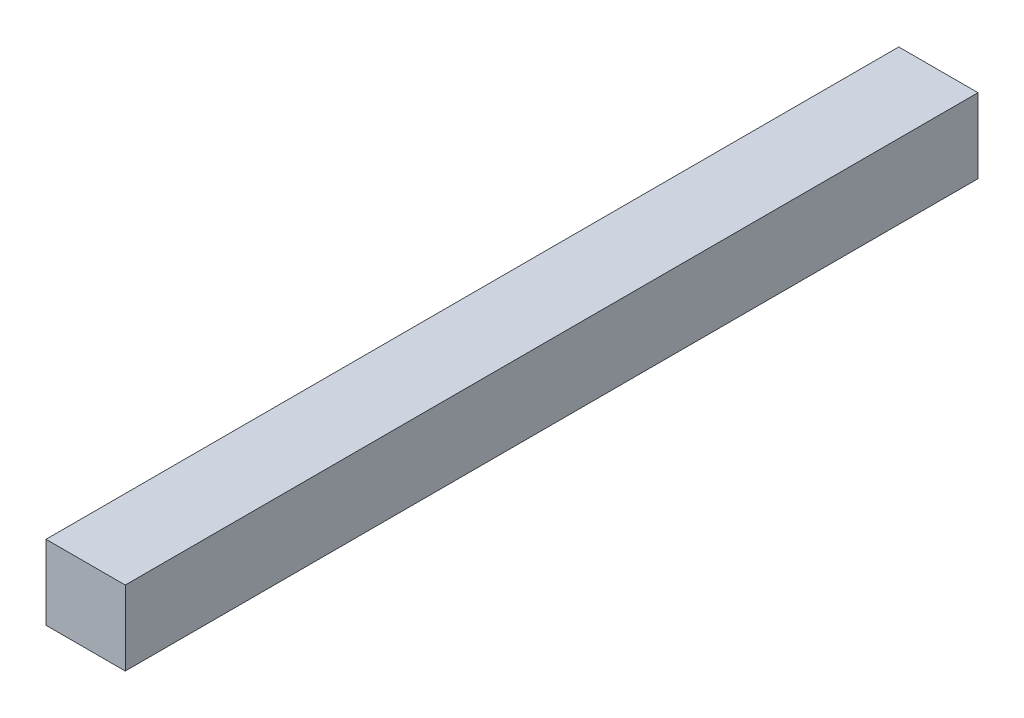
ISO-10303-21;
HEADER;
FILE_DESCRIPTION(('STEP AP214'),'2;1');
FILE_NAME('part.step','',(''),(''),'','','');
FILE_SCHEMA(('AUTOMOTIVE_DESIGN { 1 0 10303 214 1 1 1 1 }'));
ENDSEC;
DATA;
#1=APPLICATION_CONTEXT('core data for automotive mechanical design processes');
#2=APPLICATION_PROTOCOL_DEFINITION('international standard','automotive_design',2000,#1);
#3=PRODUCT_CONTEXT('',#1,'mechanical');
#4=PRODUCT('Part','Part','',(#3));
#5=PRODUCT_RELATED_PRODUCT_CATEGORY('part','',(#4));
#6=PRODUCT_DEFINITION_FORMATION('','',#4);
#7=PRODUCT_DEFINITION_CONTEXT('part definition',#1,'design');
#8=PRODUCT_DEFINITION('design','',#6,#7);
#9=PRODUCT_DEFINITION_SHAPE('','',#8);
#10=(LENGTH_UNIT() NAMED_UNIT(*) SI_UNIT(.MILLI.,.METRE.));
#11=(NAMED_UNIT(*) PLANE_ANGLE_UNIT() SI_UNIT($,.RADIAN.));
#12=(NAMED_UNIT(*) SI_UNIT($,.STERADIAN.) SOLID_ANGLE_UNIT());
#13=UNCERTAINTY_MEASURE_WITH_UNIT(LENGTH_MEASURE(1.E-05),#10,'distance_accuracy_value','');
#14=(GEOMETRIC_REPRESENTATION_CONTEXT(3) GLOBAL_UNCERTAINTY_ASSIGNED_CONTEXT((#13)) GLOBAL_UNIT_ASSIGNED_CONTEXT((#10,
#11,#12)) REPRESENTATION_CONTEXT('',''));
#15=CARTESIAN_POINT('',(0.,0.,0.));
#16=DIRECTION('',(0.,0.,1.));
#17=DIRECTION('',(1.,0.,0.));
#18=AXIS2_PLACEMENT_3D('',#15,#16,#17);
#19=CARTESIAN_POINT('',(-26.6666666666666,25.1515151515151,538.));
#20=DIRECTION('',(1.,0.,0.));
#21=DIRECTION('',(0.,1.,0.));
#22=AXIS2_PLACEMENT_3D('',#19,#20,#21);
#23=PLANE('',#22);
#24=DIRECTION('',(0.,-1.,0.));
#25=VECTOR('',#24,1.);
#26=CARTESIAN_POINT('',(-26.6666666666666,25.1515151515151,0.));
#27=LINE('',#26,#25);
#28=CARTESIAN_POINT('',(-26.6666666666666,25.1515151515151,0.));
#29=VERTEX_POINT('',#28);
#30=CARTESIAN_POINT('',(-26.6666666666666,-21.8484848484849,0.));
#31=VERTEX_POINT('',#30);
#32=EDGE_CURVE('E96',#29,#31,#27,.T.);
#33=ORIENTED_EDGE('',*,*,#32,.T.);
#34=DIRECTION('',(0.,0.,-1.));
#35=VECTOR('',#34,1.);
#36=CARTESIAN_POINT('',(-26.6666666666666,-21.8484848484849,538.));
#37=LINE('',#36,#35);
#38=CARTESIAN_POINT('',(-26.6666666666666,-21.8484848484849,538.));
#39=VERTEX_POINT('',#38);
#40=EDGE_CURVE('E11',#39,#31,#37,.T.);
#41=ORIENTED_EDGE('',*,*,#40,.F.);
#42=DIRECTION('',(0.,-1.,0.));
#43=VECTOR('',#42,1.);
#44=CARTESIAN_POINT('',(-26.6666666666666,25.1515151515151,538.));
#45=LINE('',#44,#43);
#46=CARTESIAN_POINT('',(-26.6666666666666,25.1515151515151,538.));
#47=VERTEX_POINT('',#46);
#48=EDGE_CURVE('E84',#47,#39,#45,.T.);
#49=ORIENTED_EDGE('',*,*,#48,.F.);
#50=DIRECTION('',(0.,0.,-1.));
#51=VECTOR('',#50,1.);
#52=CARTESIAN_POINT('',(-26.6666666666666,25.1515151515151,538.));
#53=LINE('',#52,#51);
#54=EDGE_CURVE('E92',#47,#29,#53,.T.);
#55=ORIENTED_EDGE('',*,*,#54,.T.);
#56=EDGE_LOOP('',(#33,#41,#49,#55));
#57=FACE_BOUND('',#56,.T.);
#58=ADVANCED_FACE('F33',(#57),#23,.F.);
#59=CARTESIAN_POINT('',(-26.6666666666666,-21.8484848484849,538.));
#60=DIRECTION('',(0.,1.,0.));
#61=DIRECTION('',(0.,0.,1.));
#62=AXIS2_PLACEMENT_3D('',#59,#60,#61);
#63=PLANE('',#62);
#64=DIRECTION('',(1.,0.,0.));
#65=VECTOR('',#64,1.);
#66=CARTESIAN_POINT('',(-26.6666666666666,-21.8484848484849,0.));
#67=LINE('',#66,#65);
#68=CARTESIAN_POINT('',(23.3333333333334,-21.8484848484849,0.));
#69=VERTEX_POINT('',#68);
#70=EDGE_CURVE('E88',#31,#69,#67,.T.);
#71=ORIENTED_EDGE('',*,*,#70,.T.);
#72=DIRECTION('',(0.,0.,-1.));
#73=VECTOR('',#72,1.);
#74=CARTESIAN_POINT('',(23.3333333333334,-21.8484848484849,538.));
#75=LINE('',#74,#73);
#76=CARTESIAN_POINT('',(23.3333333333334,-21.8484848484849,538.));
#77=VERTEX_POINT('',#76);
#78=EDGE_CURVE('E41',#77,#69,#75,.T.);
#79=ORIENTED_EDGE('',*,*,#78,.F.);
#80=DIRECTION('',(1.,0.,0.));
#81=VECTOR('',#80,1.);
#82=CARTESIAN_POINT('',(-26.6666666666666,-21.8484848484849,538.));
#83=LINE('',#82,#81);
#84=EDGE_CURVE('E79',#39,#77,#83,.T.);
#85=ORIENTED_EDGE('',*,*,#84,.F.);
#86=ORIENTED_EDGE('',*,*,#40,.T.);
#87=EDGE_LOOP('',(#71,#79,#85,#86));
#88=FACE_BOUND('',#87,.T.);
#89=ADVANCED_FACE('F87',(#88),#63,.F.);
#90=CARTESIAN_POINT('',(23.3333333333334,25.1515151515151,538.));
#91=DIRECTION('',(-1.,0.,0.));
#92=DIRECTION('',(0.,-1.,0.));
#93=AXIS2_PLACEMENT_3D('',#90,#91,#92);
#94=PLANE('',#93);
#95=DIRECTION('',(0.,1.,0.));
#96=VECTOR('',#95,1.);
#97=CARTESIAN_POINT('',(23.3333333333334,25.1515151515151,0.));
#98=LINE('',#97,#96);
#99=CARTESIAN_POINT('',(23.3333333333334,25.1515151515151,0.));
#100=VERTEX_POINT('',#99);
#101=EDGE_CURVE('E66',#69,#100,#98,.T.);
#102=ORIENTED_EDGE('',*,*,#101,.T.);
#103=DIRECTION('',(0.,0.,-1.));
#104=VECTOR('',#103,1.);
#105=CARTESIAN_POINT('',(23.3333333333334,25.1515151515151,538.));
#106=LINE('',#105,#104);
#107=CARTESIAN_POINT('',(23.3333333333334,25.1515151515151,538.));
#108=VERTEX_POINT('',#107);
#109=EDGE_CURVE('E89',#108,#100,#106,.T.);
#110=ORIENTED_EDGE('',*,*,#109,.F.);
#111=DIRECTION('',(0.,1.,0.));
#112=VECTOR('',#111,1.);
#113=CARTESIAN_POINT('',(23.3333333333334,25.1515151515151,538.));
#114=LINE('',#113,#112);
#115=EDGE_CURVE('E82',#77,#108,#114,.T.);
#116=ORIENTED_EDGE('',*,*,#115,.F.);
#117=ORIENTED_EDGE('',*,*,#78,.T.);
#118=EDGE_LOOP('',(#102,#110,#116,#117));
#119=FACE_BOUND('',#118,.T.);
#120=ADVANCED_FACE('F90',(#119),#94,.F.);
#121=CARTESIAN_POINT('',(-26.6666666666666,25.1515151515151,538.));
#122=DIRECTION('',(0.,-1.,0.));
#123=DIRECTION('',(0.,0.,-1.));
#124=AXIS2_PLACEMENT_3D('',#121,#122,#123);
#125=PLANE('',#124);
#126=DIRECTION('',(-1.,0.,0.));
#127=VECTOR('',#126,1.);
#128=CARTESIAN_POINT('',(-26.6666666666666,25.1515151515151,0.));
#129=LINE('',#128,#127);
#130=EDGE_CURVE('E72',#100,#29,#129,.T.);
#131=ORIENTED_EDGE('',*,*,#130,.T.);
#132=ORIENTED_EDGE('',*,*,#54,.F.);
#133=DIRECTION('',(-1.,0.,0.));
#134=VECTOR('',#133,1.);
#135=CARTESIAN_POINT('',(-26.6666666666666,25.1515151515151,538.));
#136=LINE('',#135,#134);
#137=EDGE_CURVE('E49',#108,#47,#136,.T.);
#138=ORIENTED_EDGE('',*,*,#137,.F.);
#139=ORIENTED_EDGE('',*,*,#109,.T.);
#140=EDGE_LOOP('',(#131,#132,#138,#139));
#141=FACE_BOUND('',#140,.T.);
#142=ADVANCED_FACE('F103',(#141),#125,.F.);
#143=CARTESIAN_POINT('',(0.,0.,538.));
#144=DIRECTION('',(0.,0.,1.));
#145=DIRECTION('',(1.,0.,0.));
#146=AXIS2_PLACEMENT_3D('',#143,#144,#145);
#147=PLANE('',#146);
#148=ORIENTED_EDGE('',*,*,#48,.T.);
#149=ORIENTED_EDGE('',*,*,#84,.T.);
#150=ORIENTED_EDGE('',*,*,#115,.T.);
#151=ORIENTED_EDGE('',*,*,#137,.T.);
#152=EDGE_LOOP('',(#148,#149,#150,#151));
#153=FACE_BOUND('',#152,.T.);
#154=ADVANCED_FACE('F80',(#153),#147,.T.);
#155=CARTESIAN_POINT('',(0.,0.,0.));
#156=DIRECTION('',(0.,0.,1.));
#157=DIRECTION('',(1.,0.,0.));
#158=AXIS2_PLACEMENT_3D('',#155,#156,#157);
#159=PLANE('',#158);
#160=ORIENTED_EDGE('',*,*,#32,.F.);
#161=ORIENTED_EDGE('',*,*,#130,.F.);
#162=ORIENTED_EDGE('',*,*,#101,.F.);
#163=ORIENTED_EDGE('',*,*,#70,.F.);
#164=EDGE_LOOP('',(#160,#161,#162,#163));
#165=FACE_BOUND('',#164,.T.);
#166=ADVANCED_FACE('F106',(#165),#159,.F.);
#167=CLOSED_SHELL('',(#58,#89,#120,#142,#154,#166));
#168=MANIFOLD_SOLID_BREP('B2',#167);
#169=ADVANCED_BREP_SHAPE_REPRESENTATION('',(#18,#168),#14);
#170=SHAPE_DEFINITION_REPRESENTATION(#9,#169);
ENDSEC;
END-ISO-10303-21;
